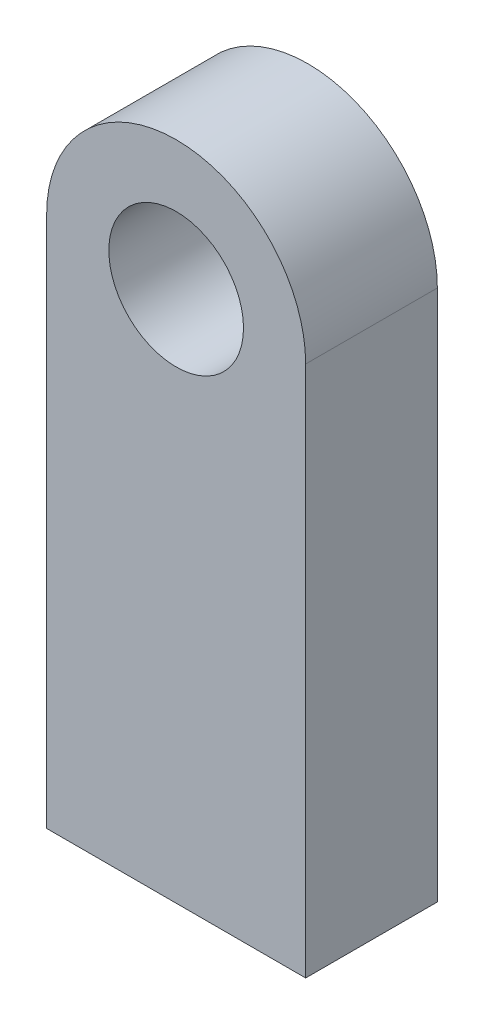
ISO-10303-21;
HEADER;
FILE_DESCRIPTION(('STEP AP214'),'2;1');
FILE_NAME('part.step','',(''),(''),'','','');
FILE_SCHEMA(('AUTOMOTIVE_DESIGN { 1 0 10303 214 1 1 1 1 }'));
ENDSEC;
DATA;
#1=APPLICATION_CONTEXT('core data for automotive mechanical design processes');
#2=APPLICATION_PROTOCOL_DEFINITION('international standard','automotive_design',2000,#1);
#3=PRODUCT_CONTEXT('',#1,'mechanical');
#4=PRODUCT('Part','Part','',(#3));
#5=PRODUCT_RELATED_PRODUCT_CATEGORY('part','',(#4));
#6=PRODUCT_DEFINITION_FORMATION('','',#4);
#7=PRODUCT_DEFINITION_CONTEXT('part definition',#1,'design');
#8=PRODUCT_DEFINITION('design','',#6,#7);
#9=PRODUCT_DEFINITION_SHAPE('','',#8);
#10=(LENGTH_UNIT() NAMED_UNIT(*) SI_UNIT(.MILLI.,.METRE.));
#11=(NAMED_UNIT(*) PLANE_ANGLE_UNIT() SI_UNIT($,.RADIAN.));
#12=(NAMED_UNIT(*) SI_UNIT($,.STERADIAN.) SOLID_ANGLE_UNIT());
#13=UNCERTAINTY_MEASURE_WITH_UNIT(LENGTH_MEASURE(1.E-05),#10,'distance_accuracy_value','');
#14=(GEOMETRIC_REPRESENTATION_CONTEXT(3) GLOBAL_UNCERTAINTY_ASSIGNED_CONTEXT((#13)) GLOBAL_UNIT_ASSIGNED_CONTEXT((#10,
#11,#12)) REPRESENTATION_CONTEXT('',''));
#15=CARTESIAN_POINT('',(0.,0.,0.));
#16=DIRECTION('',(0.,0.,1.));
#17=DIRECTION('',(1.,0.,0.));
#18=AXIS2_PLACEMENT_3D('',#15,#16,#17);
#19=CARTESIAN_POINT('',(0.,0.,10.));
#20=DIRECTION('',(-1.,0.,0.));
#21=DIRECTION('',(0.,0.,1.));
#22=AXIS2_PLACEMENT_3D('',#19,#20,#21);
#23=PLANE('',#22);
#24=DIRECTION('',(0.,1.,0.));
#25=VECTOR('',#24,1.);
#26=CARTESIAN_POINT('',(0.,0.,0.));
#27=LINE('',#26,#25);
#28=CARTESIAN_POINT('',(0.,0.,0.));
#29=VERTEX_POINT('',#28);
#30=CARTESIAN_POINT('',(0.,40.3819202093284,0.));
#31=VERTEX_POINT('',#30);
#32=EDGE_CURVE('E96',#29,#31,#27,.T.);
#33=ORIENTED_EDGE('',*,*,#32,.T.);
#34=DIRECTION('',(0.,0.,-1.));
#35=VECTOR('',#34,1.);
#36=CARTESIAN_POINT('',(0.,40.3819202093284,10.));
#37=LINE('',#36,#35);
#38=CARTESIAN_POINT('',(0.,40.3819202093284,10.));
#39=VERTEX_POINT('',#38);
#40=EDGE_CURVE('E11',#39,#31,#37,.T.);
#41=ORIENTED_EDGE('',*,*,#40,.F.);
#42=DIRECTION('',(0.,1.,0.));
#43=VECTOR('',#42,1.);
#44=CARTESIAN_POINT('',(0.,0.,10.));
#45=LINE('',#44,#43);
#46=CARTESIAN_POINT('',(0.,0.,10.));
#47=VERTEX_POINT('',#46);
#48=EDGE_CURVE('E84',#47,#39,#45,.T.);
#49=ORIENTED_EDGE('',*,*,#48,.F.);
#50=DIRECTION('',(0.,0.,-1.));
#51=VECTOR('',#50,1.);
#52=CARTESIAN_POINT('',(0.,0.,10.));
#53=LINE('',#52,#51);
#54=EDGE_CURVE('E92',#47,#29,#53,.T.);
#55=ORIENTED_EDGE('',*,*,#54,.T.);
#56=EDGE_LOOP('',(#33,#41,#49,#55));
#57=FACE_BOUND('',#56,.T.);
#58=ADVANCED_FACE('F33',(#57),#23,.F.);
#59=CARTESIAN_POINT('',(-9.83513815986507,40.3819202093284,10.));
#60=DIRECTION('',(0.,0.,-1.));
#61=DIRECTION('',(-1.,0.,0.));
#62=AXIS2_PLACEMENT_3D('',#59,#60,#61);
#63=CYLINDRICAL_SURFACE('',#62,9.83513815986507);
#64=CARTESIAN_POINT('',(-9.83513815986507,40.3819202093284,0.));
#65=DIRECTION('',(0.,0.,1.));
#66=DIRECTION('',(-1.,0.,0.));
#67=AXIS2_PLACEMENT_3D('',#64,#65,#66);
#68=CIRCLE('',#67,9.83513815986507);
#69=CARTESIAN_POINT('',(-19.6702763197301,40.3819202093284,0.));
#70=VERTEX_POINT('',#69);
#71=EDGE_CURVE('E88',#31,#70,#68,.T.);
#72=ORIENTED_EDGE('',*,*,#71,.T.);
#73=DIRECTION('',(0.,0.,-1.));
#74=VECTOR('',#73,1.);
#75=CARTESIAN_POINT('',(-19.6702763197301,40.3819202093284,10.));
#76=LINE('',#75,#74);
#77=CARTESIAN_POINT('',(-19.6702763197301,40.3819202093284,10.));
#78=VERTEX_POINT('',#77);
#79=EDGE_CURVE('E41',#78,#70,#76,.T.);
#80=ORIENTED_EDGE('',*,*,#79,.F.);
#81=CARTESIAN_POINT('',(-9.83513815986507,40.3819202093284,10.));
#82=DIRECTION('',(0.,0.,1.));
#83=DIRECTION('',(-1.,0.,0.));
#84=AXIS2_PLACEMENT_3D('',#81,#82,#83);
#85=CIRCLE('',#84,9.83513815986507);
#86=EDGE_CURVE('E79',#39,#78,#85,.T.);
#87=ORIENTED_EDGE('',*,*,#86,.F.);
#88=ORIENTED_EDGE('',*,*,#40,.T.);
#89=EDGE_LOOP('',(#72,#80,#87,#88));
#90=FACE_BOUND('',#89,.T.);
#91=ADVANCED_FACE('F87',(#90),#63,.T.);
#92=CARTESIAN_POINT('',(-19.6702763197301,0.,10.));
#93=DIRECTION('',(1.,0.,0.));
#94=DIRECTION('',(0.,0.,-1.));
#95=AXIS2_PLACEMENT_3D('',#92,#93,#94);
#96=PLANE('',#95);
#97=DIRECTION('',(0.,-1.,0.));
#98=VECTOR('',#97,1.);
#99=CARTESIAN_POINT('',(-19.6702763197301,0.,0.));
#100=LINE('',#99,#98);
#101=CARTESIAN_POINT('',(-19.6702763197301,0.,0.));
#102=VERTEX_POINT('',#101);
#103=EDGE_CURVE('E66',#70,#102,#100,.T.);
#104=ORIENTED_EDGE('',*,*,#103,.T.);
#105=DIRECTION('',(0.,0.,-1.));
#106=VECTOR('',#105,1.);
#107=CARTESIAN_POINT('',(-19.6702763197301,0.,10.));
#108=LINE('',#107,#106);
#109=CARTESIAN_POINT('',(-19.6702763197301,0.,10.));
#110=VERTEX_POINT('',#109);
#111=EDGE_CURVE('E89',#110,#102,#108,.T.);
#112=ORIENTED_EDGE('',*,*,#111,.F.);
#113=DIRECTION('',(0.,-1.,0.));
#114=VECTOR('',#113,1.);
#115=CARTESIAN_POINT('',(-19.6702763197301,0.,10.));
#116=LINE('',#115,#114);
#117=EDGE_CURVE('E82',#78,#110,#116,.T.);
#118=ORIENTED_EDGE('',*,*,#117,.F.);
#119=ORIENTED_EDGE('',*,*,#79,.T.);
#120=EDGE_LOOP('',(#104,#112,#118,#119));
#121=FACE_BOUND('',#120,.T.);
#122=ADVANCED_FACE('F90',(#121),#96,.F.);
#123=CARTESIAN_POINT('',(0.,0.,10.));
#124=DIRECTION('',(0.,1.,0.));
#125=DIRECTION('',(0.,0.,1.));
#126=AXIS2_PLACEMENT_3D('',#123,#124,#125);
#127=PLANE('',#126);
#128=DIRECTION('',(1.,0.,0.));
#129=VECTOR('',#128,1.);
#130=CARTESIAN_POINT('',(0.,0.,0.));
#131=LINE('',#130,#129);
#132=EDGE_CURVE('E72',#102,#29,#131,.T.);
#133=ORIENTED_EDGE('',*,*,#132,.T.);
#134=ORIENTED_EDGE('',*,*,#54,.F.);
#135=DIRECTION('',(1.,0.,0.));
#136=VECTOR('',#135,1.);
#137=CARTESIAN_POINT('',(0.,0.,10.));
#138=LINE('',#137,#136);
#139=EDGE_CURVE('E49',#110,#47,#138,.T.);
#140=ORIENTED_EDGE('',*,*,#139,.F.);
#141=ORIENTED_EDGE('',*,*,#111,.T.);
#142=EDGE_LOOP('',(#133,#134,#140,#141));
#143=FACE_BOUND('',#142,.T.);
#144=ADVANCED_FACE('F104',(#143),#127,.F.);
#145=CARTESIAN_POINT('',(-9.83513815986507,40.3819202093284,10.));
#146=DIRECTION('',(0.,0.,-1.));
#147=DIRECTION('',(-1.,0.,0.));
#148=AXIS2_PLACEMENT_3D('',#145,#146,#147);
#149=PLANE('',#148);
#150=CARTESIAN_POINT('',(-9.83513815986507,40.3819202093284,10.));
#151=DIRECTION('',(0.,0.,1.));
#152=DIRECTION('',(1.,0.,0.));
#153=AXIS2_PLACEMENT_3D('',#150,#151,#152);
#154=CIRCLE('',#153,5.11405911076156);
#155=CARTESIAN_POINT('',(-4.72107904910351,40.3819202093284,10.));
#156=VERTEX_POINT('',#155);
#157=EDGE_CURVE('E99',#156,#156,#154,.T.);
#158=ORIENTED_EDGE('',*,*,#157,.F.);
#159=EDGE_LOOP('',(#158));
#160=FACE_BOUND('',#159,.T.);
#161=ORIENTED_EDGE('',*,*,#48,.T.);
#162=ORIENTED_EDGE('',*,*,#86,.T.);
#163=ORIENTED_EDGE('',*,*,#117,.T.);
#164=ORIENTED_EDGE('',*,*,#139,.T.);
#165=EDGE_LOOP('',(#161,#162,#163,#164));
#166=FACE_BOUND('',#165,.T.);
#167=ADVANCED_FACE('F80',(#160,#166),#149,.F.);
#168=CARTESIAN_POINT('',(-9.83513815986507,40.3819202093284,0.));
#169=DIRECTION('',(0.,0.,-1.));
#170=DIRECTION('',(-1.,0.,0.));
#171=AXIS2_PLACEMENT_3D('',#168,#169,#170);
#172=PLANE('',#171);
#173=CARTESIAN_POINT('',(-9.83513815986507,40.3819202093284,0.));
#174=DIRECTION('',(0.,0.,-1.));
#175=DIRECTION('',(-1.,0.,0.));
#176=AXIS2_PLACEMENT_3D('',#173,#174,#175);
#177=CIRCLE('',#176,5.11405911076156);
#178=CARTESIAN_POINT('',(-14.9491972706266,40.3819202093284,0.));
#179=VERTEX_POINT('',#178);
#180=EDGE_CURVE('E110',#179,#179,#177,.F.);
#181=ORIENTED_EDGE('',*,*,#180,.T.);
#182=EDGE_LOOP('',(#181));
#183=FACE_BOUND('',#182,.T.);
#184=ORIENTED_EDGE('',*,*,#32,.F.);
#185=ORIENTED_EDGE('',*,*,#132,.F.);
#186=ORIENTED_EDGE('',*,*,#103,.F.);
#187=ORIENTED_EDGE('',*,*,#71,.F.);
#188=EDGE_LOOP('',(#184,#185,#186,#187));
#189=FACE_BOUND('',#188,.T.);
#190=ADVANCED_FACE('F107',(#183,#189),#172,.T.);
#191=CARTESIAN_POINT('',(-9.83513815986507,40.3819202093284,-0.000999999999999265));
#192=DIRECTION('',(0.,0.,1.));
#193=DIRECTION('',(1.,0.,0.));
#194=AXIS2_PLACEMENT_3D('',#191,#192,#193);
#195=CYLINDRICAL_SURFACE('',#194,5.11405911076156);
#196=ORIENTED_EDGE('',*,*,#180,.F.);
#197=EDGE_LOOP('',(#196));
#198=FACE_BOUND('',#197,.T.);
#199=ORIENTED_EDGE('',*,*,#157,.T.);
#200=EDGE_LOOP('',(#199));
#201=FACE_BOUND('',#200,.T.);
#202=ADVANCED_FACE('F116',(#198,#201),#195,.F.);
#203=CLOSED_SHELL('',(#58,#91,#122,#144,#167,#190,#202));
#204=MANIFOLD_SOLID_BREP('B2',#203);
#205=ADVANCED_BREP_SHAPE_REPRESENTATION('',(#18,#204),#14);
#206=SHAPE_DEFINITION_REPRESENTATION(#9,#205);
ENDSEC;
END-ISO-10303-21;
